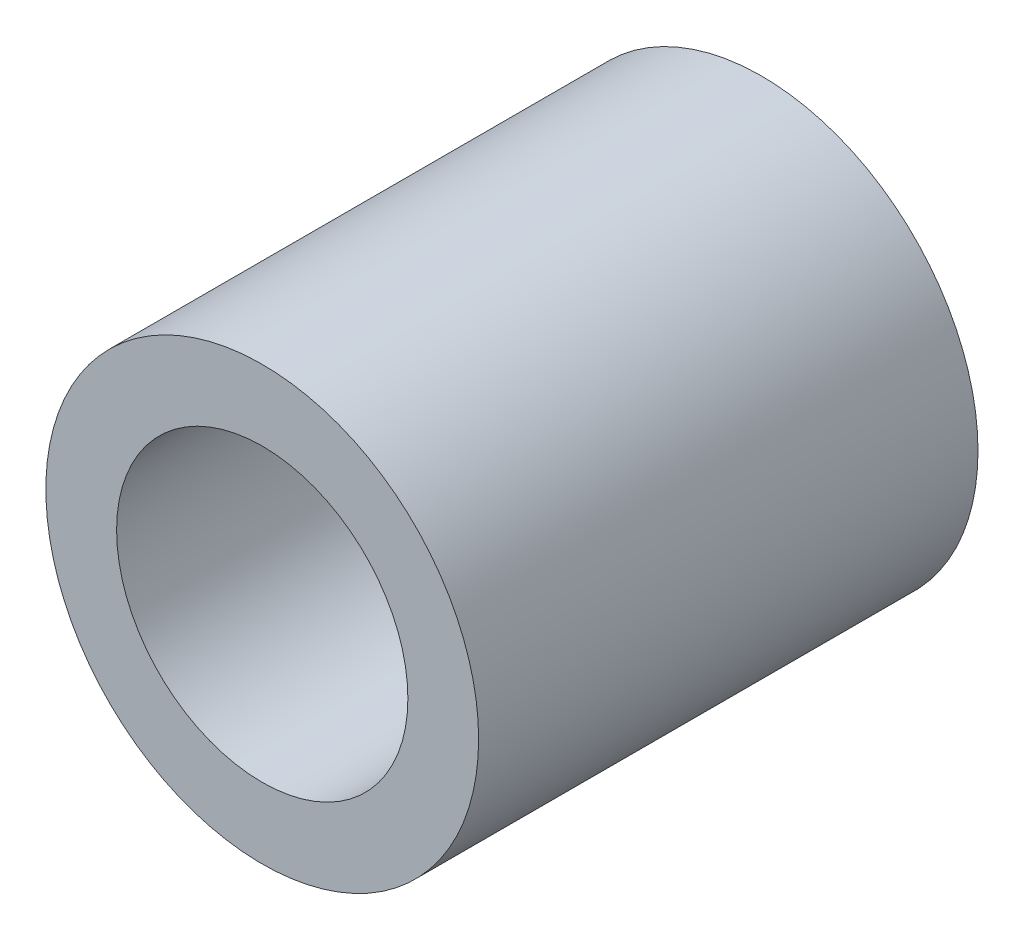
ISO-10303-21;
HEADER;
FILE_DESCRIPTION(('STEP AP214'),'2;1');
FILE_NAME('part.step','',(''),(''),'','','');
FILE_SCHEMA(('AUTOMOTIVE_DESIGN { 1 0 10303 214 1 1 1 1 }'));
ENDSEC;
DATA;
#1=APPLICATION_CONTEXT('core data for automotive mechanical design processes');
#2=APPLICATION_PROTOCOL_DEFINITION('international standard','automotive_design',2000,#1);
#3=PRODUCT_CONTEXT('',#1,'mechanical');
#4=PRODUCT('Part','Part','',(#3));
#5=PRODUCT_RELATED_PRODUCT_CATEGORY('part','',(#4));
#6=PRODUCT_DEFINITION_FORMATION('','',#4);
#7=PRODUCT_DEFINITION_CONTEXT('part definition',#1,'design');
#8=PRODUCT_DEFINITION('design','',#6,#7);
#9=PRODUCT_DEFINITION_SHAPE('','',#8);
#10=(LENGTH_UNIT() NAMED_UNIT(*) SI_UNIT(.MILLI.,.METRE.));
#11=(NAMED_UNIT(*) PLANE_ANGLE_UNIT() SI_UNIT($,.RADIAN.));
#12=(NAMED_UNIT(*) SI_UNIT($,.STERADIAN.) SOLID_ANGLE_UNIT());
#13=UNCERTAINTY_MEASURE_WITH_UNIT(LENGTH_MEASURE(1.E-05),#10,'distance_accuracy_value','');
#14=(GEOMETRIC_REPRESENTATION_CONTEXT(3) GLOBAL_UNCERTAINTY_ASSIGNED_CONTEXT((#13)) GLOBAL_UNIT_ASSIGNED_CONTEXT((#10,
#11,#12)) REPRESENTATION_CONTEXT('',''));
#15=CARTESIAN_POINT('',(0.,0.,0.));
#16=DIRECTION('',(0.,0.,1.));
#17=DIRECTION('',(1.,0.,0.));
#18=AXIS2_PLACEMENT_3D('',#15,#16,#17);
#19=CARTESIAN_POINT('',(0.,0.,6.));
#20=DIRECTION('',(0.,0.,1.));
#21=DIRECTION('',(1.,0.,0.));
#22=AXIS2_PLACEMENT_3D('',#19,#20,#21);
#23=PLANE('',#22);
#24=CARTESIAN_POINT('',(0.,0.,6.));
#25=DIRECTION('',(0.,0.,1.));
#26=DIRECTION('',(1.,0.,0.));
#27=AXIS2_PLACEMENT_3D('',#24,#25,#26);
#28=CIRCLE('',#27,2.6);
#29=CARTESIAN_POINT('',(2.6,0.,6.));
#30=VERTEX_POINT('',#29);
#31=EDGE_CURVE('E10',#30,#30,#28,.T.);
#32=ORIENTED_EDGE('',*,*,#31,.T.);
#33=EDGE_LOOP('',(#32));
#34=FACE_BOUND('',#33,.T.);
#35=CARTESIAN_POINT('',(0.,0.,6.));
#36=DIRECTION('',(0.,0.,1.));
#37=DIRECTION('',(1.,0.,0.));
#38=AXIS2_PLACEMENT_3D('',#35,#36,#37);
#39=CIRCLE('',#38,1.75);
#40=CARTESIAN_POINT('',(1.75,0.,6.));
#41=VERTEX_POINT('',#40);
#42=EDGE_CURVE('E43',#41,#41,#39,.T.);
#43=ORIENTED_EDGE('',*,*,#42,.F.);
#44=EDGE_LOOP('',(#43));
#45=FACE_BOUND('',#44,.T.);
#46=ADVANCED_FACE('F32',(#34,#45),#23,.T.);
#47=CARTESIAN_POINT('',(0.,0.,0.));
#48=DIRECTION('',(0.,0.,1.));
#49=DIRECTION('',(1.,0.,0.));
#50=AXIS2_PLACEMENT_3D('',#47,#48,#49);
#51=PLANE('',#50);
#52=CARTESIAN_POINT('',(0.,0.,0.));
#53=DIRECTION('',(0.,0.,1.));
#54=DIRECTION('',(1.,0.,0.));
#55=AXIS2_PLACEMENT_3D('',#52,#53,#54);
#56=CIRCLE('',#55,2.6);
#57=CARTESIAN_POINT('',(2.6,0.,0.));
#58=VERTEX_POINT('',#57);
#59=EDGE_CURVE('E36',#58,#58,#56,.T.);
#60=ORIENTED_EDGE('',*,*,#59,.F.);
#61=EDGE_LOOP('',(#60));
#62=FACE_BOUND('',#61,.T.);
#63=CARTESIAN_POINT('',(0.,0.,0.));
#64=DIRECTION('',(0.,0.,1.));
#65=DIRECTION('',(1.,0.,0.));
#66=AXIS2_PLACEMENT_3D('',#63,#64,#65);
#67=CIRCLE('',#66,1.75);
#68=CARTESIAN_POINT('',(1.75,0.,0.));
#69=VERTEX_POINT('',#68);
#70=EDGE_CURVE('E45',#69,#69,#67,.T.);
#71=ORIENTED_EDGE('',*,*,#70,.T.);
#72=EDGE_LOOP('',(#71));
#73=FACE_BOUND('',#72,.T.);
#74=ADVANCED_FACE('F55',(#62,#73),#51,.F.);
#75=CARTESIAN_POINT('',(0.,0.,6.));
#76=DIRECTION('',(0.,0.,-1.));
#77=DIRECTION('',(-1.,0.,0.));
#78=AXIS2_PLACEMENT_3D('',#75,#76,#77);
#79=CYLINDRICAL_SURFACE('',#78,2.6);
#80=ORIENTED_EDGE('',*,*,#31,.F.);
#81=EDGE_LOOP('',(#80));
#82=FACE_BOUND('',#81,.T.);
#83=ORIENTED_EDGE('',*,*,#59,.T.);
#84=EDGE_LOOP('',(#83));
#85=FACE_BOUND('',#84,.T.);
#86=ADVANCED_FACE('F34',(#82,#85),#79,.T.);
#87=CARTESIAN_POINT('',(0.,0.,6.));
#88=DIRECTION('',(0.,0.,-1.));
#89=DIRECTION('',(-1.,0.,0.));
#90=AXIS2_PLACEMENT_3D('',#87,#88,#89);
#91=CYLINDRICAL_SURFACE('',#90,1.75);
#92=ORIENTED_EDGE('',*,*,#42,.T.);
#93=EDGE_LOOP('',(#92));
#94=FACE_BOUND('',#93,.T.);
#95=ORIENTED_EDGE('',*,*,#70,.F.);
#96=EDGE_LOOP('',(#95));
#97=FACE_BOUND('',#96,.T.);
#98=ADVANCED_FACE('F51',(#94,#97),#91,.F.);
#99=CLOSED_SHELL('',(#46,#74,#86,#98));
#100=MANIFOLD_SOLID_BREP('B2',#99);
#101=ADVANCED_BREP_SHAPE_REPRESENTATION('',(#18,#100),#14);
#102=SHAPE_DEFINITION_REPRESENTATION(#9,#101);
ENDSEC;
END-ISO-10303-21;
